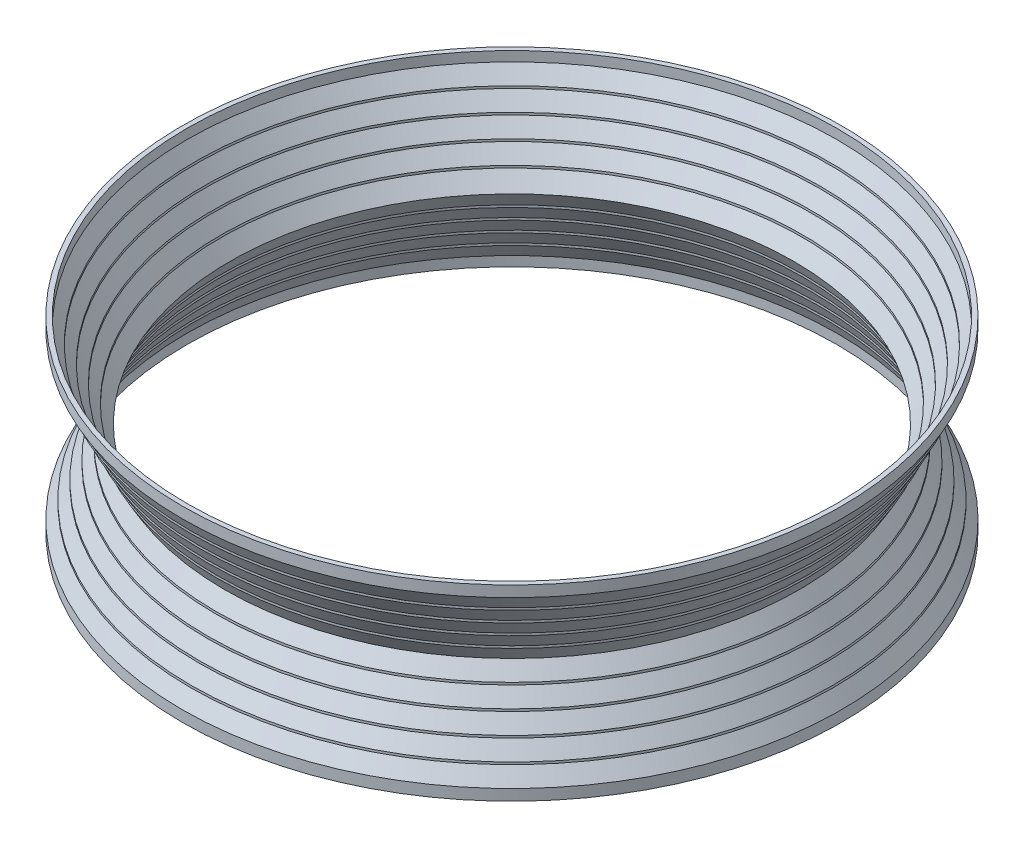
ISO-10303-21;
HEADER;
FILE_DESCRIPTION(('STEP AP214'),'2;1');
FILE_NAME('part.step','',(''),(''),'','','');
FILE_SCHEMA(('AUTOMOTIVE_DESIGN { 1 0 10303 214 1 1 1 1 }'));
ENDSEC;
DATA;
#1=APPLICATION_CONTEXT('core data for automotive mechanical design processes');
#2=APPLICATION_PROTOCOL_DEFINITION('international standard','automotive_design',2000,#1);
#3=PRODUCT_CONTEXT('',#1,'mechanical');
#4=PRODUCT('Part','Part','',(#3));
#5=PRODUCT_RELATED_PRODUCT_CATEGORY('part','',(#4));
#6=PRODUCT_DEFINITION_FORMATION('','',#4);
#7=PRODUCT_DEFINITION_CONTEXT('part definition',#1,'design');
#8=PRODUCT_DEFINITION('design','',#6,#7);
#9=PRODUCT_DEFINITION_SHAPE('','',#8);
#10=(LENGTH_UNIT() NAMED_UNIT(*) SI_UNIT(.MILLI.,.METRE.));
#11=(NAMED_UNIT(*) PLANE_ANGLE_UNIT() SI_UNIT($,.RADIAN.));
#12=(NAMED_UNIT(*) SI_UNIT($,.STERADIAN.) SOLID_ANGLE_UNIT());
#13=UNCERTAINTY_MEASURE_WITH_UNIT(LENGTH_MEASURE(1.E-05),#10,'distance_accuracy_value','');
#14=(GEOMETRIC_REPRESENTATION_CONTEXT(3) GLOBAL_UNCERTAINTY_ASSIGNED_CONTEXT((#13)) GLOBAL_UNIT_ASSIGNED_CONTEXT((#10,
#11,#12)) REPRESENTATION_CONTEXT('',''));
#15=CARTESIAN_POINT('',(0.,0.,0.));
#16=DIRECTION('',(0.,0.,1.));
#17=DIRECTION('',(1.,0.,0.));
#18=AXIS2_PLACEMENT_3D('',#15,#16,#17);
#19=CARTESIAN_POINT('',(0.,1.2,0.));
#20=DIRECTION('',(0.,-1.,0.));
#21=DIRECTION('',(0.,0.,-1.));
#22=AXIS2_PLACEMENT_3D('',#19,#20,#21);
#23=CYLINDRICAL_SURFACE('',#22,35.8938037049019);
#24=CARTESIAN_POINT('',(0.,1.2,0.));
#25=DIRECTION('',(0.,1.,0.));
#26=DIRECTION('',(0.,0.,1.));
#27=AXIS2_PLACEMENT_3D('',#24,#25,#26);
#28=CIRCLE('',#27,35.8938037049019);
#29=CARTESIAN_POINT('',(0.,1.2,35.8938037049019));
#30=VERTEX_POINT('',#29);
#31=EDGE_CURVE('E10',#30,#30,#28,.T.);
#32=ORIENTED_EDGE('',*,*,#31,.F.);
#33=EDGE_LOOP('',(#32));
#34=FACE_BOUND('',#33,.T.);
#35=CARTESIAN_POINT('',(0.,0.,0.));
#36=DIRECTION('',(0.,1.,0.));
#37=DIRECTION('',(0.,0.,1.));
#38=AXIS2_PLACEMENT_3D('',#35,#36,#37);
#39=CIRCLE('',#38,35.8938037049019);
#40=CARTESIAN_POINT('',(0.,0.,35.8938037049019));
#41=VERTEX_POINT('',#40);
#42=EDGE_CURVE('E41',#41,#41,#39,.T.);
#43=ORIENTED_EDGE('',*,*,#42,.T.);
#44=EDGE_LOOP('',(#43));
#45=FACE_BOUND('',#44,.T.);
#46=ADVANCED_FACE('F38',(#34,#45),#23,.T.);
#47=CARTESIAN_POINT('',(0.,0.,0.));
#48=DIRECTION('',(0.,1.,0.));
#49=DIRECTION('',(0.,0.,1.));
#50=AXIS2_PLACEMENT_3D('',#47,#48,#49);
#51=PLANE('',#50);
#52=CARTESIAN_POINT('',(0.,0.,0.));
#53=DIRECTION('',(0.,1.,0.));
#54=DIRECTION('',(0.,0.,1.));
#55=AXIS2_PLACEMENT_3D('',#52,#53,#54);
#56=CIRCLE('',#55,35.3938037049019);
#57=CARTESIAN_POINT('',(0.,0.,35.3938037049019));
#58=VERTEX_POINT('',#57);
#59=EDGE_CURVE('E112',#58,#58,#56,.T.);
#60=ORIENTED_EDGE('',*,*,#59,.T.);
#61=EDGE_LOOP('',(#60));
#62=FACE_BOUND('',#61,.T.);
#63=ORIENTED_EDGE('',*,*,#42,.F.);
#64=EDGE_LOOP('',(#63));
#65=FACE_BOUND('',#64,.T.);
#66=ADVANCED_FACE('F190',(#62,#65),#51,.F.);
#67=CARTESIAN_POINT('',(0.,8.60000000000004,0.));
#68=DIRECTION('',(0.,-1.,0.));
#69=DIRECTION('',(0.,0.,-1.));
#70=AXIS2_PLACEMENT_3D('',#67,#68,#69);
#71=CONICAL_SURFACE('',#70,32.1987619820883,0.5235987755983);
#72=CARTESIAN_POINT('',(0.,10.2,0.));
#73=DIRECTION('',(0.,1.,0.));
#74=DIRECTION('',(0.,0.,1.));
#75=AXIS2_PLACEMENT_3D('',#72,#73,#74);
#76=CIRCLE('',#75,31.2750015513849);
#77=CARTESIAN_POINT('',(0.,10.2,31.2750015513849));
#78=VERTEX_POINT('',#77);
#79=EDGE_CURVE('E48',#78,#78,#76,.T.);
#80=ORIENTED_EDGE('',*,*,#79,.F.);
#81=EDGE_LOOP('',(#80));
#82=FACE_BOUND('',#81,.T.);
#83=CARTESIAN_POINT('',(0.,8.60000000000004,0.));
#84=DIRECTION('',(0.,1.,0.));
#85=DIRECTION('',(0.,0.,1.));
#86=AXIS2_PLACEMENT_3D('',#83,#84,#85);
#87=CIRCLE('',#86,32.1987619820883);
#88=CARTESIAN_POINT('',(0.,8.60000000000004,32.1987619820883));
#89=VERTEX_POINT('',#88);
#90=EDGE_CURVE('E52',#89,#89,#87,.T.);
#91=ORIENTED_EDGE('',*,*,#90,.T.);
#92=EDGE_LOOP('',(#91));
#93=FACE_BOUND('',#92,.T.);
#94=ADVANCED_FACE('F195',(#82,#93),#71,.T.);
#95=CARTESIAN_POINT('',(0.,10.2,0.));
#96=DIRECTION('',(0.,1.,0.));
#97=DIRECTION('',(0.,0.,1.));
#98=AXIS2_PLACEMENT_3D('',#95,#96,#97);
#99=CYLINDRICAL_SURFACE('',#98,32.1987619820883);
#100=ORIENTED_EDGE('',*,*,#90,.F.);
#101=EDGE_LOOP('',(#100));
#102=FACE_BOUND('',#101,.T.);
#103=CARTESIAN_POINT('',(0.,8.35000000000004,0.));
#104=DIRECTION('',(0.,1.,0.));
#105=DIRECTION('',(0.,0.,1.));
#106=AXIS2_PLACEMENT_3D('',#103,#104,#105);
#107=CIRCLE('',#106,32.1987619820883);
#108=CARTESIAN_POINT('',(0.,8.35000000000004,32.1987619820883));
#109=VERTEX_POINT('',#108);
#110=EDGE_CURVE('E55',#109,#109,#107,.T.);
#111=ORIENTED_EDGE('',*,*,#110,.T.);
#112=EDGE_LOOP('',(#111));
#113=FACE_BOUND('',#112,.T.);
#114=ADVANCED_FACE('F203',(#102,#113),#99,.T.);
#115=CARTESIAN_POINT('',(0.,6.75000000000003,0.));
#116=DIRECTION('',(0.,-1.,0.));
#117=DIRECTION('',(0.,0.,-1.));
#118=AXIS2_PLACEMENT_3D('',#115,#116,#117);
#119=CONICAL_SURFACE('',#118,33.1225224127917,0.523598775598292);
#120=ORIENTED_EDGE('',*,*,#110,.F.);
#121=EDGE_LOOP('',(#120));
#122=FACE_BOUND('',#121,.T.);
#123=CARTESIAN_POINT('',(0.,6.75000000000003,0.));
#124=DIRECTION('',(0.,1.,0.));
#125=DIRECTION('',(0.,0.,1.));
#126=AXIS2_PLACEMENT_3D('',#123,#124,#125);
#127=CIRCLE('',#126,33.1225224127917);
#128=CARTESIAN_POINT('',(0.,6.75000000000003,33.1225224127917));
#129=VERTEX_POINT('',#128);
#130=EDGE_CURVE('E58',#129,#129,#127,.T.);
#131=ORIENTED_EDGE('',*,*,#130,.T.);
#132=EDGE_LOOP('',(#131));
#133=FACE_BOUND('',#132,.T.);
#134=ADVANCED_FACE('F209',(#122,#133),#119,.T.);
#135=CARTESIAN_POINT('',(0.,10.2,0.));
#136=DIRECTION('',(0.,1.,0.));
#137=DIRECTION('',(0.,0.,1.));
#138=AXIS2_PLACEMENT_3D('',#135,#136,#137);
#139=CYLINDRICAL_SURFACE('',#138,33.1225224127917);
#140=ORIENTED_EDGE('',*,*,#130,.F.);
#141=EDGE_LOOP('',(#140));
#142=FACE_BOUND('',#141,.T.);
#143=CARTESIAN_POINT('',(0.,6.50000000000002,0.));
#144=DIRECTION('',(0.,1.,0.));
#145=DIRECTION('',(0.,0.,1.));
#146=AXIS2_PLACEMENT_3D('',#143,#144,#145);
#147=CIRCLE('',#146,33.1225224127917);
#148=CARTESIAN_POINT('',(0.,6.50000000000002,33.1225224127917));
#149=VERTEX_POINT('',#148);
#150=EDGE_CURVE('E61',#149,#149,#147,.T.);
#151=ORIENTED_EDGE('',*,*,#150,.T.);
#152=EDGE_LOOP('',(#151));
#153=FACE_BOUND('',#152,.T.);
#154=ADVANCED_FACE('F213',(#142,#153),#139,.T.);
#155=CARTESIAN_POINT('',(0.,4.90000000000002,0.));
#156=DIRECTION('',(0.,-1.,0.));
#157=DIRECTION('',(0.,0.,-1.));
#158=AXIS2_PLACEMENT_3D('',#155,#156,#157);
#159=CONICAL_SURFACE('',#158,34.0462828434951,0.523598775598296);
#160=ORIENTED_EDGE('',*,*,#150,.F.);
#161=EDGE_LOOP('',(#160));
#162=FACE_BOUND('',#161,.T.);
#163=CARTESIAN_POINT('',(0.,4.90000000000002,0.));
#164=DIRECTION('',(0.,1.,0.));
#165=DIRECTION('',(0.,0.,1.));
#166=AXIS2_PLACEMENT_3D('',#163,#164,#165);
#167=CIRCLE('',#166,34.0462828434951);
#168=CARTESIAN_POINT('',(0.,4.90000000000002,34.0462828434951));
#169=VERTEX_POINT('',#168);
#170=EDGE_CURVE('E64',#169,#169,#167,.T.);
#171=ORIENTED_EDGE('',*,*,#170,.T.);
#172=EDGE_LOOP('',(#171));
#173=FACE_BOUND('',#172,.T.);
#174=ADVANCED_FACE('F217',(#162,#173),#159,.T.);
#175=CARTESIAN_POINT('',(0.,10.2,0.));
#176=DIRECTION('',(0.,1.,0.));
#177=DIRECTION('',(0.,0.,1.));
#178=AXIS2_PLACEMENT_3D('',#175,#176,#177);
#179=CYLINDRICAL_SURFACE('',#178,34.0462828434951);
#180=ORIENTED_EDGE('',*,*,#170,.F.);
#181=EDGE_LOOP('',(#180));
#182=FACE_BOUND('',#181,.T.);
#183=CARTESIAN_POINT('',(0.,4.65000000000002,0.));
#184=DIRECTION('',(0.,1.,0.));
#185=DIRECTION('',(0.,0.,1.));
#186=AXIS2_PLACEMENT_3D('',#183,#184,#185);
#187=CIRCLE('',#186,34.0462828434951);
#188=CARTESIAN_POINT('',(0.,4.65000000000002,34.0462828434951));
#189=VERTEX_POINT('',#188);
#190=EDGE_CURVE('E67',#189,#189,#187,.T.);
#191=ORIENTED_EDGE('',*,*,#190,.T.);
#192=EDGE_LOOP('',(#191));
#193=FACE_BOUND('',#192,.T.);
#194=ADVANCED_FACE('F221',(#182,#193),#179,.T.);
#195=CARTESIAN_POINT('',(0.,3.05000000000001,0.));
#196=DIRECTION('',(0.,-1.,0.));
#197=DIRECTION('',(0.,0.,-1.));
#198=AXIS2_PLACEMENT_3D('',#195,#196,#197);
#199=CONICAL_SURFACE('',#198,34.9700432741985,0.523598775598296);
#200=ORIENTED_EDGE('',*,*,#190,.F.);
#201=EDGE_LOOP('',(#200));
#202=FACE_BOUND('',#201,.T.);
#203=CARTESIAN_POINT('',(0.,3.05000000000001,0.));
#204=DIRECTION('',(0.,1.,0.));
#205=DIRECTION('',(0.,0.,1.));
#206=AXIS2_PLACEMENT_3D('',#203,#204,#205);
#207=CIRCLE('',#206,34.9700432741985);
#208=CARTESIAN_POINT('',(0.,3.05000000000001,34.9700432741985));
#209=VERTEX_POINT('',#208);
#210=EDGE_CURVE('E70',#209,#209,#207,.T.);
#211=ORIENTED_EDGE('',*,*,#210,.T.);
#212=EDGE_LOOP('',(#211));
#213=FACE_BOUND('',#212,.T.);
#214=ADVANCED_FACE('F225',(#202,#213),#199,.T.);
#215=CARTESIAN_POINT('',(0.,10.2,0.));
#216=DIRECTION('',(0.,1.,0.));
#217=DIRECTION('',(0.,0.,1.));
#218=AXIS2_PLACEMENT_3D('',#215,#216,#217);
#219=CYLINDRICAL_SURFACE('',#218,34.9700432741985);
#220=ORIENTED_EDGE('',*,*,#210,.F.);
#221=EDGE_LOOP('',(#220));
#222=FACE_BOUND('',#221,.T.);
#223=CARTESIAN_POINT('',(0.,2.80000000000001,0.));
#224=DIRECTION('',(0.,1.,0.));
#225=DIRECTION('',(0.,0.,1.));
#226=AXIS2_PLACEMENT_3D('',#223,#224,#225);
#227=CIRCLE('',#226,34.9700432741985);
#228=CARTESIAN_POINT('',(0.,2.80000000000001,34.9700432741985));
#229=VERTEX_POINT('',#228);
#230=EDGE_CURVE('E73',#229,#229,#227,.T.);
#231=ORIENTED_EDGE('',*,*,#230,.T.);
#232=EDGE_LOOP('',(#231));
#233=FACE_BOUND('',#232,.T.);
#234=ADVANCED_FACE('F229',(#222,#233),#219,.T.);
#235=CARTESIAN_POINT('',(0.,1.2,0.));
#236=DIRECTION('',(0.,-1.,0.));
#237=DIRECTION('',(0.,0.,-1.));
#238=AXIS2_PLACEMENT_3D('',#235,#236,#237);
#239=CONICAL_SURFACE('',#238,35.8938037049019,0.523598775598296);
#240=ORIENTED_EDGE('',*,*,#230,.F.);
#241=EDGE_LOOP('',(#240));
#242=FACE_BOUND('',#241,.T.);
#243=ORIENTED_EDGE('',*,*,#31,.T.);
#244=EDGE_LOOP('',(#243));
#245=FACE_BOUND('',#244,.T.);
#246=ADVANCED_FACE('F233',(#242,#245),#239,.T.);
#247=CARTESIAN_POINT('',(0.,19.2,0.));
#248=DIRECTION('',(0.,1.,0.));
#249=DIRECTION('',(0.,0.,-1.));
#250=AXIS2_PLACEMENT_3D('',#247,#248,#249);
#251=CYLINDRICAL_SURFACE('',#250,35.8938037049019);
#252=CARTESIAN_POINT('',(0.,19.2,0.));
#253=DIRECTION('',(0.,1.,0.));
#254=DIRECTION('',(0.,0.,1.));
#255=AXIS2_PLACEMENT_3D('',#252,#253,#254);
#256=CIRCLE('',#255,35.8938037049019);
#257=CARTESIAN_POINT('',(0.,19.2,35.8938037049019));
#258=VERTEX_POINT('',#257);
#259=EDGE_CURVE('E76',#258,#258,#256,.T.);
#260=ORIENTED_EDGE('',*,*,#259,.T.);
#261=EDGE_LOOP('',(#260));
#262=FACE_BOUND('',#261,.T.);
#263=CARTESIAN_POINT('',(0.,20.4,0.));
#264=DIRECTION('',(0.,1.,0.));
#265=DIRECTION('',(0.,0.,1.));
#266=AXIS2_PLACEMENT_3D('',#263,#264,#265);
#267=CIRCLE('',#266,35.8938037049019);
#268=CARTESIAN_POINT('',(0.,20.4,35.8938037049019));
#269=VERTEX_POINT('',#268);
#270=EDGE_CURVE('E77',#269,#269,#267,.T.);
#271=ORIENTED_EDGE('',*,*,#270,.F.);
#272=EDGE_LOOP('',(#271));
#273=FACE_BOUND('',#272,.T.);
#274=ADVANCED_FACE('F237',(#262,#273),#251,.T.);
#275=CARTESIAN_POINT('',(0.,20.4,0.));
#276=DIRECTION('',(0.,-1.,0.));
#277=DIRECTION('',(0.,0.,1.));
#278=AXIS2_PLACEMENT_3D('',#275,#276,#277);
#279=PLANE('',#278);
#280=CARTESIAN_POINT('',(0.,20.4,0.));
#281=DIRECTION('',(0.,-1.,0.));
#282=DIRECTION('',(0.,0.,-1.));
#283=AXIS2_PLACEMENT_3D('',#280,#281,#282);
#284=CIRCLE('',#283,35.3938037049019);
#285=CARTESIAN_POINT('',(0.,20.4,-35.3938037049019));
#286=VERTEX_POINT('',#285);
#287=EDGE_CURVE('E107',#286,#286,#284,.F.);
#288=ORIENTED_EDGE('',*,*,#287,.F.);
#289=EDGE_LOOP('',(#288));
#290=FACE_BOUND('',#289,.T.);
#291=ORIENTED_EDGE('',*,*,#270,.T.);
#292=EDGE_LOOP('',(#291));
#293=FACE_BOUND('',#292,.T.);
#294=ADVANCED_FACE('F241',(#290,#293),#279,.F.);
#295=CARTESIAN_POINT('',(0.,11.8,0.));
#296=DIRECTION('',(0.,1.,0.));
#297=DIRECTION('',(0.,0.,-1.));
#298=AXIS2_PLACEMENT_3D('',#295,#296,#297);
#299=CONICAL_SURFACE('',#298,32.1987619820883,0.5235987755983);
#300=ORIENTED_EDGE('',*,*,#79,.T.);
#301=EDGE_LOOP('',(#300));
#302=FACE_BOUND('',#301,.T.);
#303=CARTESIAN_POINT('',(0.,11.8,0.));
#304=DIRECTION('',(0.,1.,0.));
#305=DIRECTION('',(0.,0.,1.));
#306=AXIS2_PLACEMENT_3D('',#303,#304,#305);
#307=CIRCLE('',#306,32.1987619820883);
#308=CARTESIAN_POINT('',(0.,11.8,32.1987619820883));
#309=VERTEX_POINT('',#308);
#310=EDGE_CURVE('E80',#309,#309,#307,.T.);
#311=ORIENTED_EDGE('',*,*,#310,.F.);
#312=EDGE_LOOP('',(#311));
#313=FACE_BOUND('',#312,.T.);
#314=ADVANCED_FACE('F245',(#302,#313),#299,.T.);
#315=CARTESIAN_POINT('',(0.,10.2,0.));
#316=DIRECTION('',(0.,-1.,0.));
#317=DIRECTION('',(0.,0.,1.));
#318=AXIS2_PLACEMENT_3D('',#315,#316,#317);
#319=CYLINDRICAL_SURFACE('',#318,32.1987619820883);
#320=ORIENTED_EDGE('',*,*,#310,.T.);
#321=EDGE_LOOP('',(#320));
#322=FACE_BOUND('',#321,.T.);
#323=CARTESIAN_POINT('',(0.,12.05,0.));
#324=DIRECTION('',(0.,1.,0.));
#325=DIRECTION('',(0.,0.,1.));
#326=AXIS2_PLACEMENT_3D('',#323,#324,#325);
#327=CIRCLE('',#326,32.1987619820883);
#328=CARTESIAN_POINT('',(0.,12.05,32.1987619820883));
#329=VERTEX_POINT('',#328);
#330=EDGE_CURVE('E85',#329,#329,#327,.T.);
#331=ORIENTED_EDGE('',*,*,#330,.F.);
#332=EDGE_LOOP('',(#331));
#333=FACE_BOUND('',#332,.T.);
#334=ADVANCED_FACE('F249',(#322,#333),#319,.T.);
#335=CARTESIAN_POINT('',(0.,13.65,0.));
#336=DIRECTION('',(0.,1.,0.));
#337=DIRECTION('',(0.,0.,-1.));
#338=AXIS2_PLACEMENT_3D('',#335,#336,#337);
#339=CONICAL_SURFACE('',#338,33.1225224127917,0.523598775598292);
#340=ORIENTED_EDGE('',*,*,#330,.T.);
#341=EDGE_LOOP('',(#340));
#342=FACE_BOUND('',#341,.T.);
#343=CARTESIAN_POINT('',(0.,13.65,0.));
#344=DIRECTION('',(0.,1.,0.));
#345=DIRECTION('',(0.,0.,1.));
#346=AXIS2_PLACEMENT_3D('',#343,#344,#345);
#347=CIRCLE('',#346,33.1225224127917);
#348=CARTESIAN_POINT('',(0.,13.65,33.1225224127917));
#349=VERTEX_POINT('',#348);
#350=EDGE_CURVE('E88',#349,#349,#347,.T.);
#351=ORIENTED_EDGE('',*,*,#350,.F.);
#352=EDGE_LOOP('',(#351));
#353=FACE_BOUND('',#352,.T.);
#354=ADVANCED_FACE('F253',(#342,#353),#339,.T.);
#355=CARTESIAN_POINT('',(0.,10.2,0.));
#356=DIRECTION('',(0.,-1.,0.));
#357=DIRECTION('',(0.,0.,1.));
#358=AXIS2_PLACEMENT_3D('',#355,#356,#357);
#359=CYLINDRICAL_SURFACE('',#358,33.1225224127917);
#360=ORIENTED_EDGE('',*,*,#350,.T.);
#361=EDGE_LOOP('',(#360));
#362=FACE_BOUND('',#361,.T.);
#363=CARTESIAN_POINT('',(0.,13.9,0.));
#364=DIRECTION('',(0.,1.,0.));
#365=DIRECTION('',(0.,0.,1.));
#366=AXIS2_PLACEMENT_3D('',#363,#364,#365);
#367=CIRCLE('',#366,33.1225224127917);
#368=CARTESIAN_POINT('',(0.,13.9,33.1225224127917));
#369=VERTEX_POINT('',#368);
#370=EDGE_CURVE('E91',#369,#369,#367,.T.);
#371=ORIENTED_EDGE('',*,*,#370,.F.);
#372=EDGE_LOOP('',(#371));
#373=FACE_BOUND('',#372,.T.);
#374=ADVANCED_FACE('F257',(#362,#373),#359,.T.);
#375=CARTESIAN_POINT('',(0.,15.5,0.));
#376=DIRECTION('',(0.,1.,0.));
#377=DIRECTION('',(0.,0.,-1.));
#378=AXIS2_PLACEMENT_3D('',#375,#376,#377);
#379=CONICAL_SURFACE('',#378,34.0462828434951,0.523598775598296);
#380=ORIENTED_EDGE('',*,*,#370,.T.);
#381=EDGE_LOOP('',(#380));
#382=FACE_BOUND('',#381,.T.);
#383=CARTESIAN_POINT('',(0.,15.5,0.));
#384=DIRECTION('',(0.,1.,0.));
#385=DIRECTION('',(0.,0.,1.));
#386=AXIS2_PLACEMENT_3D('',#383,#384,#385);
#387=CIRCLE('',#386,34.0462828434951);
#388=CARTESIAN_POINT('',(0.,15.5,34.0462828434951));
#389=VERTEX_POINT('',#388);
#390=EDGE_CURVE('E94',#389,#389,#387,.T.);
#391=ORIENTED_EDGE('',*,*,#390,.F.);
#392=EDGE_LOOP('',(#391));
#393=FACE_BOUND('',#392,.T.);
#394=ADVANCED_FACE('F261',(#382,#393),#379,.T.);
#395=CARTESIAN_POINT('',(0.,10.2,0.));
#396=DIRECTION('',(0.,-1.,0.));
#397=DIRECTION('',(0.,0.,1.));
#398=AXIS2_PLACEMENT_3D('',#395,#396,#397);
#399=CYLINDRICAL_SURFACE('',#398,34.0462828434951);
#400=ORIENTED_EDGE('',*,*,#390,.T.);
#401=EDGE_LOOP('',(#400));
#402=FACE_BOUND('',#401,.T.);
#403=CARTESIAN_POINT('',(0.,15.75,0.));
#404=DIRECTION('',(0.,1.,0.));
#405=DIRECTION('',(0.,0.,1.));
#406=AXIS2_PLACEMENT_3D('',#403,#404,#405);
#407=CIRCLE('',#406,34.0462828434951);
#408=CARTESIAN_POINT('',(0.,15.75,34.0462828434951));
#409=VERTEX_POINT('',#408);
#410=EDGE_CURVE('E97',#409,#409,#407,.T.);
#411=ORIENTED_EDGE('',*,*,#410,.F.);
#412=EDGE_LOOP('',(#411));
#413=FACE_BOUND('',#412,.T.);
#414=ADVANCED_FACE('F265',(#402,#413),#399,.T.);
#415=CARTESIAN_POINT('',(0.,17.35,0.));
#416=DIRECTION('',(0.,1.,0.));
#417=DIRECTION('',(0.,0.,-1.));
#418=AXIS2_PLACEMENT_3D('',#415,#416,#417);
#419=CONICAL_SURFACE('',#418,34.9700432741985,0.523598775598296);
#420=ORIENTED_EDGE('',*,*,#410,.T.);
#421=EDGE_LOOP('',(#420));
#422=FACE_BOUND('',#421,.T.);
#423=CARTESIAN_POINT('',(0.,17.35,0.));
#424=DIRECTION('',(0.,1.,0.));
#425=DIRECTION('',(0.,0.,1.));
#426=AXIS2_PLACEMENT_3D('',#423,#424,#425);
#427=CIRCLE('',#426,34.9700432741985);
#428=CARTESIAN_POINT('',(0.,17.35,34.9700432741985));
#429=VERTEX_POINT('',#428);
#430=EDGE_CURVE('E100',#429,#429,#427,.T.);
#431=ORIENTED_EDGE('',*,*,#430,.F.);
#432=EDGE_LOOP('',(#431));
#433=FACE_BOUND('',#432,.T.);
#434=ADVANCED_FACE('F269',(#422,#433),#419,.T.);
#435=CARTESIAN_POINT('',(0.,10.2,0.));
#436=DIRECTION('',(0.,-1.,0.));
#437=DIRECTION('',(0.,0.,1.));
#438=AXIS2_PLACEMENT_3D('',#435,#436,#437);
#439=CYLINDRICAL_SURFACE('',#438,34.9700432741985);
#440=ORIENTED_EDGE('',*,*,#430,.T.);
#441=EDGE_LOOP('',(#440));
#442=FACE_BOUND('',#441,.T.);
#443=CARTESIAN_POINT('',(0.,17.6,0.));
#444=DIRECTION('',(0.,1.,0.));
#445=DIRECTION('',(0.,0.,1.));
#446=AXIS2_PLACEMENT_3D('',#443,#444,#445);
#447=CIRCLE('',#446,34.9700432741985);
#448=CARTESIAN_POINT('',(0.,17.6,34.9700432741985));
#449=VERTEX_POINT('',#448);
#450=EDGE_CURVE('E103',#449,#449,#447,.T.);
#451=ORIENTED_EDGE('',*,*,#450,.F.);
#452=EDGE_LOOP('',(#451));
#453=FACE_BOUND('',#452,.T.);
#454=ADVANCED_FACE('F273',(#442,#453),#439,.T.);
#455=CARTESIAN_POINT('',(0.,19.2,0.));
#456=DIRECTION('',(0.,1.,0.));
#457=DIRECTION('',(0.,0.,-1.));
#458=AXIS2_PLACEMENT_3D('',#455,#456,#457);
#459=CONICAL_SURFACE('',#458,35.8938037049019,0.523598775598296);
#460=ORIENTED_EDGE('',*,*,#450,.T.);
#461=EDGE_LOOP('',(#460));
#462=FACE_BOUND('',#461,.T.);
#463=ORIENTED_EDGE('',*,*,#259,.F.);
#464=EDGE_LOOP('',(#463));
#465=FACE_BOUND('',#464,.T.);
#466=ADVANCED_FACE('F277',(#462,#465),#459,.T.);
#467=CARTESIAN_POINT('',(0.,1.2,0.));
#468=DIRECTION('',(0.,-1.,0.));
#469=DIRECTION('',(0.,0.,-1.));
#470=AXIS2_PLACEMENT_3D('',#467,#468,#469);
#471=CYLINDRICAL_SURFACE('',#470,35.3938037049019);
#472=CARTESIAN_POINT('',(0.,1.06602540378444,0.));
#473=DIRECTION('',(0.,-1.,0.));
#474=DIRECTION('',(0.,0.,-1.));
#475=AXIS2_PLACEMENT_3D('',#472,#473,#474);
#476=CIRCLE('',#475,35.3938037049019);
#477=CARTESIAN_POINT('',(0.,1.06602540378444,-35.3938037049019));
#478=VERTEX_POINT('',#477);
#479=EDGE_CURVE('E106',#478,#478,#476,.F.);
#480=ORIENTED_EDGE('',*,*,#479,.T.);
#481=EDGE_LOOP('',(#480));
#482=FACE_BOUND('',#481,.T.);
#483=ORIENTED_EDGE('',*,*,#59,.F.);
#484=EDGE_LOOP('',(#483));
#485=FACE_BOUND('',#484,.T.);
#486=ADVANCED_FACE('F170',(#482,#485),#471,.F.);
#487=CARTESIAN_POINT('',(0.,8.35000000000004,0.));
#488=DIRECTION('',(0.,-1.,0.));
#489=DIRECTION('',(0.,0.,-1.));
#490=AXIS2_PLACEMENT_3D('',#487,#488,#489);
#491=CONICAL_SURFACE('',#490,31.7657492801961,0.5235987755983);
#492=CARTESIAN_POINT('',(0.,10.2,0.));
#493=DIRECTION('',(0.,1.,0.));
#494=DIRECTION('',(0.,0.,1.));
#495=AXIS2_PLACEMENT_3D('',#492,#493,#494);
#496=CIRCLE('',#495,30.6976512821953);
#497=CARTESIAN_POINT('',(0.,10.2,30.6976512821953));
#498=VERTEX_POINT('',#497);
#499=EDGE_CURVE('E115',#498,#498,#496,.T.);
#500=ORIENTED_EDGE('',*,*,#499,.T.);
#501=EDGE_LOOP('',(#500));
#502=FACE_BOUND('',#501,.T.);
#503=CARTESIAN_POINT('',(0.,8.46602540378446,0.));
#504=DIRECTION('',(0.,-1.,0.));
#505=DIRECTION('',(0.,0.,-1.));
#506=AXIS2_PLACEMENT_3D('',#503,#504,#505);
#507=CIRCLE('',#506,31.6987619820883);
#508=CARTESIAN_POINT('',(0.,8.46602540378446,-31.6987619820883));
#509=VERTEX_POINT('',#508);
#510=EDGE_CURVE('E144',#509,#509,#507,.F.);
#511=ORIENTED_EDGE('',*,*,#510,.F.);
#512=EDGE_LOOP('',(#511));
#513=FACE_BOUND('',#512,.T.);
#514=ADVANCED_FACE('F343',(#502,#513),#491,.F.);
#515=CARTESIAN_POINT('',(0.,10.2,0.));
#516=DIRECTION('',(0.,1.,0.));
#517=DIRECTION('',(0.,0.,1.));
#518=AXIS2_PLACEMENT_3D('',#515,#516,#517);
#519=CYLINDRICAL_SURFACE('',#518,31.6987619820883);
#520=ORIENTED_EDGE('',*,*,#510,.T.);
#521=EDGE_LOOP('',(#520));
#522=FACE_BOUND('',#521,.T.);
#523=CARTESIAN_POINT('',(0.,8.21602540378448,0.));
#524=DIRECTION('',(0.,-1.,0.));
#525=DIRECTION('',(0.,0.,-1.));
#526=AXIS2_PLACEMENT_3D('',#523,#524,#525);
#527=CIRCLE('',#526,31.6987619820883);
#528=CARTESIAN_POINT('',(0.,8.21602540378448,-31.6987619820883));
#529=VERTEX_POINT('',#528);
#530=EDGE_CURVE('E147',#529,#529,#527,.F.);
#531=ORIENTED_EDGE('',*,*,#530,.F.);
#532=EDGE_LOOP('',(#531));
#533=FACE_BOUND('',#532,.T.);
#534=ADVANCED_FACE('F346',(#522,#533),#519,.F.);
#535=CARTESIAN_POINT('',(0.,6.50000000000003,0.));
#536=DIRECTION('',(0.,-1.,0.));
#537=DIRECTION('',(0.,0.,-1.));
#538=AXIS2_PLACEMENT_3D('',#535,#536,#537);
#539=CONICAL_SURFACE('',#538,32.6895097108995,0.523598775598292);
#540=ORIENTED_EDGE('',*,*,#530,.T.);
#541=EDGE_LOOP('',(#540));
#542=FACE_BOUND('',#541,.T.);
#543=CARTESIAN_POINT('',(0.,6.61602540378448,0.));
#544=DIRECTION('',(0.,-1.,0.));
#545=DIRECTION('',(0.,0.,-1.));
#546=AXIS2_PLACEMENT_3D('',#543,#544,#545);
#547=CIRCLE('',#546,32.6225224127917);
#548=CARTESIAN_POINT('',(0.,6.61602540378448,-32.6225224127917));
#549=VERTEX_POINT('',#548);
#550=EDGE_CURVE('E150',#549,#549,#547,.F.);
#551=ORIENTED_EDGE('',*,*,#550,.F.);
#552=EDGE_LOOP('',(#551));
#553=FACE_BOUND('',#552,.T.);
#554=ADVANCED_FACE('F352',(#542,#553),#539,.F.);
#555=CARTESIAN_POINT('',(0.,10.2,0.));
#556=DIRECTION('',(0.,1.,0.));
#557=DIRECTION('',(0.,0.,1.));
#558=AXIS2_PLACEMENT_3D('',#555,#556,#557);
#559=CYLINDRICAL_SURFACE('',#558,32.6225224127917);
#560=ORIENTED_EDGE('',*,*,#550,.T.);
#561=EDGE_LOOP('',(#560));
#562=FACE_BOUND('',#561,.T.);
#563=CARTESIAN_POINT('',(0.,6.36602540378446,0.));
#564=DIRECTION('',(0.,-1.,0.));
#565=DIRECTION('',(0.,0.,-1.));
#566=AXIS2_PLACEMENT_3D('',#563,#564,#565);
#567=CIRCLE('',#566,32.6225224127917);
#568=CARTESIAN_POINT('',(0.,6.36602540378446,-32.6225224127917));
#569=VERTEX_POINT('',#568);
#570=EDGE_CURVE('E153',#569,#569,#567,.F.);
#571=ORIENTED_EDGE('',*,*,#570,.F.);
#572=EDGE_LOOP('',(#571));
#573=FACE_BOUND('',#572,.T.);
#574=ADVANCED_FACE('F358',(#562,#573),#559,.F.);
#575=CARTESIAN_POINT('',(0.,4.65000000000002,0.));
#576=DIRECTION('',(0.,-1.,0.));
#577=DIRECTION('',(0.,0.,-1.));
#578=AXIS2_PLACEMENT_3D('',#575,#576,#577);
#579=CONICAL_SURFACE('',#578,33.6132701416029,0.523598775598296);
#580=ORIENTED_EDGE('',*,*,#570,.T.);
#581=EDGE_LOOP('',(#580));
#582=FACE_BOUND('',#581,.T.);
#583=CARTESIAN_POINT('',(0.,4.76602540378446,0.));
#584=DIRECTION('',(0.,-1.,0.));
#585=DIRECTION('',(0.,0.,-1.));
#586=AXIS2_PLACEMENT_3D('',#583,#584,#585);
#587=CIRCLE('',#586,33.5462828434951);
#588=CARTESIAN_POINT('',(0.,4.76602540378446,-33.5462828434951));
#589=VERTEX_POINT('',#588);
#590=EDGE_CURVE('E156',#589,#589,#587,.F.);
#591=ORIENTED_EDGE('',*,*,#590,.F.);
#592=EDGE_LOOP('',(#591));
#593=FACE_BOUND('',#592,.T.);
#594=ADVANCED_FACE('F364',(#582,#593),#579,.F.);
#595=CARTESIAN_POINT('',(0.,10.2,0.));
#596=DIRECTION('',(0.,1.,0.));
#597=DIRECTION('',(0.,0.,1.));
#598=AXIS2_PLACEMENT_3D('',#595,#596,#597);
#599=CYLINDRICAL_SURFACE('',#598,33.5462828434951);
#600=ORIENTED_EDGE('',*,*,#590,.T.);
#601=EDGE_LOOP('',(#600));
#602=FACE_BOUND('',#601,.T.);
#603=CARTESIAN_POINT('',(0.,4.51602540378445,0.));
#604=DIRECTION('',(0.,-1.,0.));
#605=DIRECTION('',(0.,0.,-1.));
#606=AXIS2_PLACEMENT_3D('',#603,#604,#605);
#607=CIRCLE('',#606,33.5462828434951);
#608=CARTESIAN_POINT('',(0.,4.51602540378445,-33.5462828434951));
#609=VERTEX_POINT('',#608);
#610=EDGE_CURVE('E159',#609,#609,#607,.F.);
#611=ORIENTED_EDGE('',*,*,#610,.F.);
#612=EDGE_LOOP('',(#611));
#613=FACE_BOUND('',#612,.T.);
#614=ADVANCED_FACE('F370',(#602,#613),#599,.F.);
#615=CARTESIAN_POINT('',(0.,2.80000000000001,0.));
#616=DIRECTION('',(0.,-1.,0.));
#617=DIRECTION('',(0.,0.,-1.));
#618=AXIS2_PLACEMENT_3D('',#615,#616,#617);
#619=CONICAL_SURFACE('',#618,34.5370305723063,0.523598775598296);
#620=ORIENTED_EDGE('',*,*,#610,.T.);
#621=EDGE_LOOP('',(#620));
#622=FACE_BOUND('',#621,.T.);
#623=CARTESIAN_POINT('',(0.,2.91602540378445,0.));
#624=DIRECTION('',(0.,-1.,0.));
#625=DIRECTION('',(0.,0.,-1.));
#626=AXIS2_PLACEMENT_3D('',#623,#624,#625);
#627=CIRCLE('',#626,34.4700432741985);
#628=CARTESIAN_POINT('',(0.,2.91602540378445,-34.4700432741985));
#629=VERTEX_POINT('',#628);
#630=EDGE_CURVE('E162',#629,#629,#627,.F.);
#631=ORIENTED_EDGE('',*,*,#630,.F.);
#632=EDGE_LOOP('',(#631));
#633=FACE_BOUND('',#632,.T.);
#634=ADVANCED_FACE('F186',(#622,#633),#619,.F.);
#635=CARTESIAN_POINT('',(0.,10.2,0.));
#636=DIRECTION('',(0.,1.,0.));
#637=DIRECTION('',(0.,0.,1.));
#638=AXIS2_PLACEMENT_3D('',#635,#636,#637);
#639=CYLINDRICAL_SURFACE('',#638,34.4700432741985);
#640=ORIENTED_EDGE('',*,*,#630,.T.);
#641=EDGE_LOOP('',(#640));
#642=FACE_BOUND('',#641,.T.);
#643=CARTESIAN_POINT('',(0.,2.66602540378445,0.));
#644=DIRECTION('',(0.,-1.,0.));
#645=DIRECTION('',(0.,0.,-1.));
#646=AXIS2_PLACEMENT_3D('',#643,#644,#645);
#647=CIRCLE('',#646,34.4700432741985);
#648=CARTESIAN_POINT('',(0.,2.66602540378445,-34.4700432741985));
#649=VERTEX_POINT('',#648);
#650=EDGE_CURVE('E118',#649,#649,#647,.F.);
#651=ORIENTED_EDGE('',*,*,#650,.F.);
#652=EDGE_LOOP('',(#651));
#653=FACE_BOUND('',#652,.T.);
#654=ADVANCED_FACE('F176',(#642,#653),#639,.F.);
#655=CARTESIAN_POINT('',(0.,0.950000000000003,0.));
#656=DIRECTION('',(0.,-1.,0.));
#657=DIRECTION('',(0.,0.,-1.));
#658=AXIS2_PLACEMENT_3D('',#655,#656,#657);
#659=CONICAL_SURFACE('',#658,35.4607910030097,0.523598775598296);
#660=ORIENTED_EDGE('',*,*,#650,.T.);
#661=EDGE_LOOP('',(#660));
#662=FACE_BOUND('',#661,.T.);
#663=ORIENTED_EDGE('',*,*,#479,.F.);
#664=EDGE_LOOP('',(#663));
#665=FACE_BOUND('',#664,.T.);
#666=ADVANCED_FACE('F173',(#662,#665),#659,.F.);
#667=CARTESIAN_POINT('',(0.,19.2,0.));
#668=DIRECTION('',(0.,1.,0.));
#669=DIRECTION('',(0.,0.,-1.));
#670=AXIS2_PLACEMENT_3D('',#667,#668,#669);
#671=CYLINDRICAL_SURFACE('',#670,35.3938037049019);
#672=CARTESIAN_POINT('',(0.,19.3339745962156,0.));
#673=DIRECTION('',(0.,1.,0.));
#674=DIRECTION('',(0.,0.,1.));
#675=AXIS2_PLACEMENT_3D('',#672,#673,#674);
#676=CIRCLE('',#675,35.3938037049019);
#677=CARTESIAN_POINT('',(0.,19.3339745962156,35.3938037049019));
#678=VERTEX_POINT('',#677);
#679=EDGE_CURVE('E110',#678,#678,#676,.T.);
#680=ORIENTED_EDGE('',*,*,#679,.F.);
#681=EDGE_LOOP('',(#680));
#682=FACE_BOUND('',#681,.T.);
#683=ORIENTED_EDGE('',*,*,#287,.T.);
#684=EDGE_LOOP('',(#683));
#685=FACE_BOUND('',#684,.T.);
#686=ADVANCED_FACE('F175',(#682,#685),#671,.F.);
#687=CARTESIAN_POINT('',(0.,12.05,0.));
#688=DIRECTION('',(0.,1.,0.));
#689=DIRECTION('',(0.,0.,-1.));
#690=AXIS2_PLACEMENT_3D('',#687,#688,#689);
#691=CONICAL_SURFACE('',#690,31.7657492801961,0.5235987755983);
#692=ORIENTED_EDGE('',*,*,#499,.F.);
#693=EDGE_LOOP('',(#692));
#694=FACE_BOUND('',#693,.T.);
#695=CARTESIAN_POINT('',(0.,11.9339745962156,0.));
#696=DIRECTION('',(0.,1.,0.));
#697=DIRECTION('',(0.,0.,1.));
#698=AXIS2_PLACEMENT_3D('',#695,#696,#697);
#699=CIRCLE('',#698,31.6987619820883);
#700=CARTESIAN_POINT('',(0.,11.9339745962156,31.6987619820883));
#701=VERTEX_POINT('',#700);
#702=EDGE_CURVE('E111',#701,#701,#699,.T.);
#703=ORIENTED_EDGE('',*,*,#702,.T.);
#704=EDGE_LOOP('',(#703));
#705=FACE_BOUND('',#704,.T.);
#706=ADVANCED_FACE('F183',(#694,#705),#691,.F.);
#707=CARTESIAN_POINT('',(0.,10.2,0.));
#708=DIRECTION('',(0.,-1.,0.));
#709=DIRECTION('',(0.,0.,1.));
#710=AXIS2_PLACEMENT_3D('',#707,#708,#709);
#711=CYLINDRICAL_SURFACE('',#710,31.6987619820883);
#712=ORIENTED_EDGE('',*,*,#702,.F.);
#713=EDGE_LOOP('',(#712));
#714=FACE_BOUND('',#713,.T.);
#715=CARTESIAN_POINT('',(0.,12.1839745962156,0.));
#716=DIRECTION('',(0.,1.,0.));
#717=DIRECTION('',(0.,0.,1.));
#718=AXIS2_PLACEMENT_3D('',#715,#716,#717);
#719=CIRCLE('',#718,31.6987619820883);
#720=CARTESIAN_POINT('',(0.,12.1839745962156,31.6987619820883));
#721=VERTEX_POINT('',#720);
#722=EDGE_CURVE('E137',#721,#721,#719,.T.);
#723=ORIENTED_EDGE('',*,*,#722,.T.);
#724=EDGE_LOOP('',(#723));
#725=FACE_BOUND('',#724,.T.);
#726=ADVANCED_FACE('F309',(#714,#725),#711,.F.);
#727=CARTESIAN_POINT('',(0.,13.9,0.));
#728=DIRECTION('',(0.,1.,0.));
#729=DIRECTION('',(0.,0.,-1.));
#730=AXIS2_PLACEMENT_3D('',#727,#728,#729);
#731=CONICAL_SURFACE('',#730,32.6895097108995,0.523598775598292);
#732=ORIENTED_EDGE('',*,*,#722,.F.);
#733=EDGE_LOOP('',(#732));
#734=FACE_BOUND('',#733,.T.);
#735=CARTESIAN_POINT('',(0.,13.7839745962156,0.));
#736=DIRECTION('',(0.,1.,0.));
#737=DIRECTION('',(0.,0.,1.));
#738=AXIS2_PLACEMENT_3D('',#735,#736,#737);
#739=CIRCLE('',#738,32.6225224127917);
#740=CARTESIAN_POINT('',(0.,13.7839745962156,32.6225224127917));
#741=VERTEX_POINT('',#740);
#742=EDGE_CURVE('E134',#741,#741,#739,.T.);
#743=ORIENTED_EDGE('',*,*,#742,.T.);
#744=EDGE_LOOP('',(#743));
#745=FACE_BOUND('',#744,.T.);
#746=ADVANCED_FACE('F305',(#734,#745),#731,.F.);
#747=CARTESIAN_POINT('',(0.,10.2,0.));
#748=DIRECTION('',(0.,-1.,0.));
#749=DIRECTION('',(0.,0.,1.));
#750=AXIS2_PLACEMENT_3D('',#747,#748,#749);
#751=CYLINDRICAL_SURFACE('',#750,32.6225224127917);
#752=ORIENTED_EDGE('',*,*,#742,.F.);
#753=EDGE_LOOP('',(#752));
#754=FACE_BOUND('',#753,.T.);
#755=CARTESIAN_POINT('',(0.,14.0339745962156,0.));
#756=DIRECTION('',(0.,1.,0.));
#757=DIRECTION('',(0.,0.,1.));
#758=AXIS2_PLACEMENT_3D('',#755,#756,#757);
#759=CIRCLE('',#758,32.6225224127917);
#760=CARTESIAN_POINT('',(0.,14.0339745962156,32.6225224127917));
#761=VERTEX_POINT('',#760);
#762=EDGE_CURVE('E131',#761,#761,#759,.T.);
#763=ORIENTED_EDGE('',*,*,#762,.T.);
#764=EDGE_LOOP('',(#763));
#765=FACE_BOUND('',#764,.T.);
#766=ADVANCED_FACE('F301',(#754,#765),#751,.F.);
#767=CARTESIAN_POINT('',(0.,15.75,0.));
#768=DIRECTION('',(0.,1.,0.));
#769=DIRECTION('',(0.,0.,-1.));
#770=AXIS2_PLACEMENT_3D('',#767,#768,#769);
#771=CONICAL_SURFACE('',#770,33.6132701416029,0.523598775598296);
#772=ORIENTED_EDGE('',*,*,#762,.F.);
#773=EDGE_LOOP('',(#772));
#774=FACE_BOUND('',#773,.T.);
#775=CARTESIAN_POINT('',(0.,15.6339745962156,0.));
#776=DIRECTION('',(0.,1.,0.));
#777=DIRECTION('',(0.,0.,1.));
#778=AXIS2_PLACEMENT_3D('',#775,#776,#777);
#779=CIRCLE('',#778,33.5462828434951);
#780=CARTESIAN_POINT('',(0.,15.6339745962156,33.5462828434951));
#781=VERTEX_POINT('',#780);
#782=EDGE_CURVE('E128',#781,#781,#779,.T.);
#783=ORIENTED_EDGE('',*,*,#782,.T.);
#784=EDGE_LOOP('',(#783));
#785=FACE_BOUND('',#784,.T.);
#786=ADVANCED_FACE('F297',(#774,#785),#771,.F.);
#787=CARTESIAN_POINT('',(0.,10.2,0.));
#788=DIRECTION('',(0.,-1.,0.));
#789=DIRECTION('',(0.,0.,1.));
#790=AXIS2_PLACEMENT_3D('',#787,#788,#789);
#791=CYLINDRICAL_SURFACE('',#790,33.5462828434951);
#792=ORIENTED_EDGE('',*,*,#782,.F.);
#793=EDGE_LOOP('',(#792));
#794=FACE_BOUND('',#793,.T.);
#795=CARTESIAN_POINT('',(0.,15.8839745962156,0.));
#796=DIRECTION('',(0.,1.,0.));
#797=DIRECTION('',(0.,0.,1.));
#798=AXIS2_PLACEMENT_3D('',#795,#796,#797);
#799=CIRCLE('',#798,33.5462828434951);
#800=CARTESIAN_POINT('',(0.,15.8839745962156,33.5462828434951));
#801=VERTEX_POINT('',#800);
#802=EDGE_CURVE('E125',#801,#801,#799,.T.);
#803=ORIENTED_EDGE('',*,*,#802,.T.);
#804=EDGE_LOOP('',(#803));
#805=FACE_BOUND('',#804,.T.);
#806=ADVANCED_FACE('F293',(#794,#805),#791,.F.);
#807=CARTESIAN_POINT('',(0.,17.6,0.));
#808=DIRECTION('',(0.,1.,0.));
#809=DIRECTION('',(0.,0.,-1.));
#810=AXIS2_PLACEMENT_3D('',#807,#808,#809);
#811=CONICAL_SURFACE('',#810,34.5370305723063,0.523598775598296);
#812=ORIENTED_EDGE('',*,*,#802,.F.);
#813=EDGE_LOOP('',(#812));
#814=FACE_BOUND('',#813,.T.);
#815=CARTESIAN_POINT('',(0.,17.4839745962156,0.));
#816=DIRECTION('',(0.,1.,0.));
#817=DIRECTION('',(0.,0.,1.));
#818=AXIS2_PLACEMENT_3D('',#815,#816,#817);
#819=CIRCLE('',#818,34.4700432741985);
#820=CARTESIAN_POINT('',(0.,17.4839745962156,34.4700432741985));
#821=VERTEX_POINT('',#820);
#822=EDGE_CURVE('E122',#821,#821,#819,.T.);
#823=ORIENTED_EDGE('',*,*,#822,.T.);
#824=EDGE_LOOP('',(#823));
#825=FACE_BOUND('',#824,.T.);
#826=ADVANCED_FACE('F289',(#814,#825),#811,.F.);
#827=CARTESIAN_POINT('',(0.,10.2,0.));
#828=DIRECTION('',(0.,-1.,0.));
#829=DIRECTION('',(0.,0.,1.));
#830=AXIS2_PLACEMENT_3D('',#827,#828,#829);
#831=CYLINDRICAL_SURFACE('',#830,34.4700432741985);
#832=ORIENTED_EDGE('',*,*,#822,.F.);
#833=EDGE_LOOP('',(#832));
#834=FACE_BOUND('',#833,.T.);
#835=CARTESIAN_POINT('',(0.,17.7339745962156,0.));
#836=DIRECTION('',(0.,1.,0.));
#837=DIRECTION('',(0.,0.,1.));
#838=AXIS2_PLACEMENT_3D('',#835,#836,#837);
#839=CIRCLE('',#838,34.4700432741985);
#840=CARTESIAN_POINT('',(0.,17.7339745962156,34.4700432741985));
#841=VERTEX_POINT('',#840);
#842=EDGE_CURVE('E119',#841,#841,#839,.T.);
#843=ORIENTED_EDGE('',*,*,#842,.T.);
#844=EDGE_LOOP('',(#843));
#845=FACE_BOUND('',#844,.T.);
#846=ADVANCED_FACE('F285',(#834,#845),#831,.F.);
#847=CARTESIAN_POINT('',(0.,19.45,0.));
#848=DIRECTION('',(0.,1.,0.));
#849=DIRECTION('',(0.,0.,-1.));
#850=AXIS2_PLACEMENT_3D('',#847,#848,#849);
#851=CONICAL_SURFACE('',#850,35.4607910030097,0.523598775598296);
#852=ORIENTED_EDGE('',*,*,#842,.F.);
#853=EDGE_LOOP('',(#852));
#854=FACE_BOUND('',#853,.T.);
#855=ORIENTED_EDGE('',*,*,#679,.T.);
#856=EDGE_LOOP('',(#855));
#857=FACE_BOUND('',#856,.T.);
#858=ADVANCED_FACE('F282',(#854,#857),#851,.F.);
#859=CLOSED_SHELL('',(#46,#66,#94,#114,#134,#154,#174,#194,#214,#234,#246,#274,#294,#314,#334,
#354,#374,#394,#414,#434,#454,#466,#486,#514,#534,#554,#574,#594,#614,#634,#654,#666,#686,#706,
#726,#746,#766,#786,#806,#826,#846,#858));
#860=MANIFOLD_SOLID_BREP('B2',#859);
#861=ADVANCED_BREP_SHAPE_REPRESENTATION('',(#18,#860),#14);
#862=SHAPE_DEFINITION_REPRESENTATION(#9,#861);
ENDSEC;
END-ISO-10303-21;
